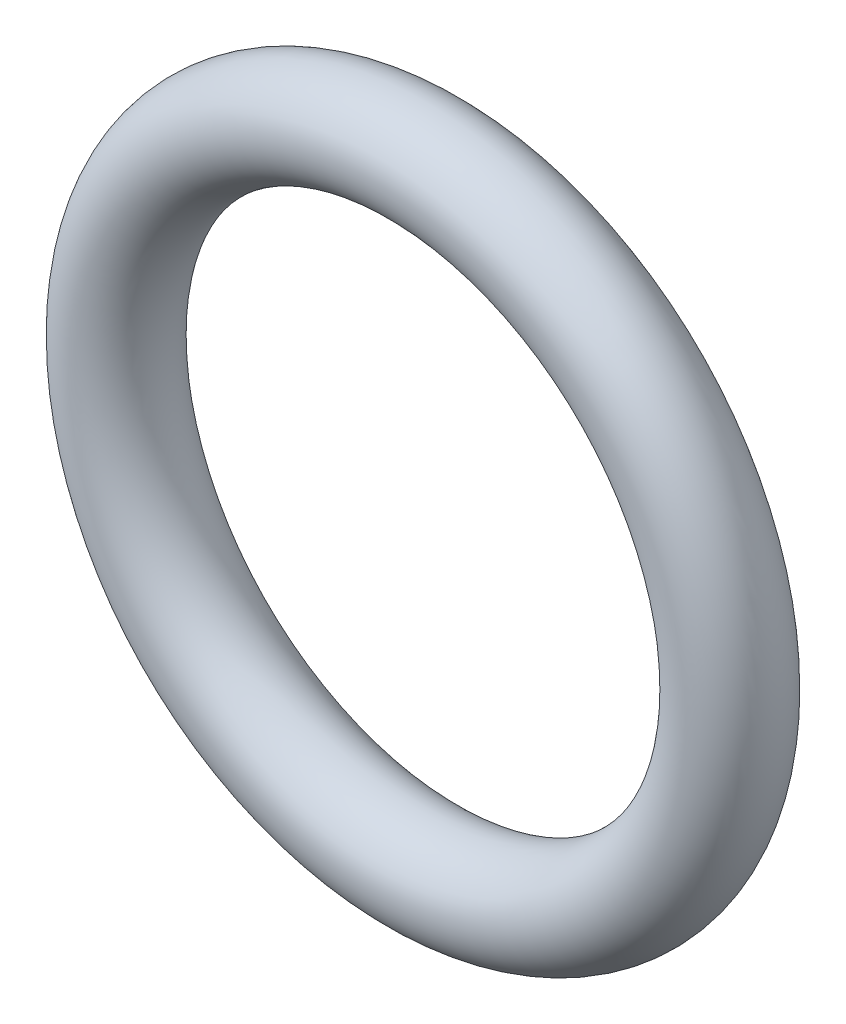
ISO-10303-21;
HEADER;
FILE_DESCRIPTION(('STEP AP214'),'2;1');
FILE_NAME('part.step','',(''),(''),'','','');
FILE_SCHEMA(('AUTOMOTIVE_DESIGN { 1 0 10303 214 1 1 1 1 }'));
ENDSEC;
DATA;
#1=APPLICATION_CONTEXT('core data for automotive mechanical design processes');
#2=APPLICATION_PROTOCOL_DEFINITION('international standard','automotive_design',2000,#1);
#3=PRODUCT_CONTEXT('',#1,'mechanical');
#4=PRODUCT('Part','Part','',(#3));
#5=PRODUCT_RELATED_PRODUCT_CATEGORY('part','',(#4));
#6=PRODUCT_DEFINITION_FORMATION('','',#4);
#7=PRODUCT_DEFINITION_CONTEXT('part definition',#1,'design');
#8=PRODUCT_DEFINITION('design','',#6,#7);
#9=PRODUCT_DEFINITION_SHAPE('','',#8);
#10=(LENGTH_UNIT() NAMED_UNIT(*) SI_UNIT(.MILLI.,.METRE.));
#11=(NAMED_UNIT(*) PLANE_ANGLE_UNIT() SI_UNIT($,.RADIAN.));
#12=(NAMED_UNIT(*) SI_UNIT($,.STERADIAN.) SOLID_ANGLE_UNIT());
#13=UNCERTAINTY_MEASURE_WITH_UNIT(LENGTH_MEASURE(1.E-05),#10,'distance_accuracy_value','');
#14=(GEOMETRIC_REPRESENTATION_CONTEXT(3) GLOBAL_UNCERTAINTY_ASSIGNED_CONTEXT((#13)) GLOBAL_UNIT_ASSIGNED_CONTEXT((#10,
#11,#12)) REPRESENTATION_CONTEXT('',''));
#15=CARTESIAN_POINT('',(0.,0.,0.));
#16=DIRECTION('',(0.,0.,1.));
#17=DIRECTION('',(1.,0.,0.));
#18=AXIS2_PLACEMENT_3D('',#15,#16,#17);
#19=CARTESIAN_POINT('',(0.,0.,0.));
#20=DIRECTION('',(0.,0.,1.));
#21=DIRECTION('',(1.,0.,0.));
#22=AXIS2_PLACEMENT_3D('',#19,#20,#21);
#23=TOROIDAL_SURFACE('',#22,5.5118,0.888999999999998);
#24=CARTESIAN_POINT('',(6.4008,0.,0.));
#25=VERTEX_POINT('',#24);
#26=VERTEX_LOOP('',#25);
#27=FACE_BOUND('',#26,.T.);
#28=ADVANCED_FACE('F28',(#27),#23,.T.);
#29=CLOSED_SHELL('',(#28));
#30=MANIFOLD_SOLID_BREP('B2',#29);
#31=ADVANCED_BREP_SHAPE_REPRESENTATION('',(#18,#30),#14);
#32=SHAPE_DEFINITION_REPRESENTATION(#9,#31);
ENDSEC;
END-ISO-10303-21;
